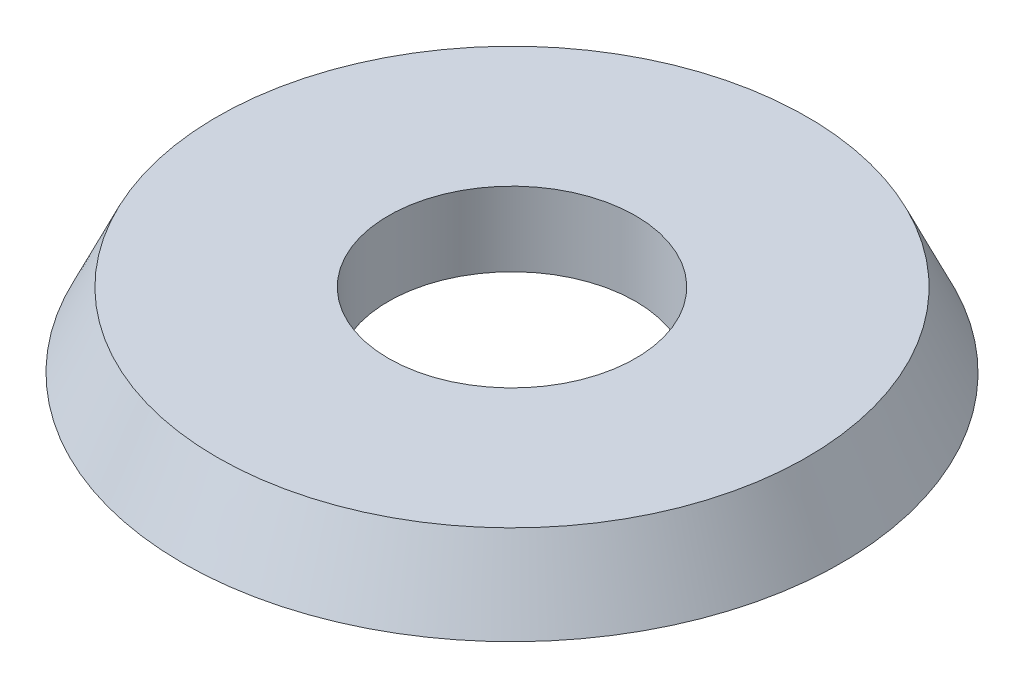
ISO-10303-21;
HEADER;
FILE_DESCRIPTION(('STEP AP214'),'2;1');
FILE_NAME('part.step','',(''),(''),'','','');
FILE_SCHEMA(('AUTOMOTIVE_DESIGN { 1 0 10303 214 1 1 1 1 }'));
ENDSEC;
DATA;
#1=APPLICATION_CONTEXT('core data for automotive mechanical design processes');
#2=APPLICATION_PROTOCOL_DEFINITION('international standard','automotive_design',2000,#1);
#3=PRODUCT_CONTEXT('',#1,'mechanical');
#4=PRODUCT('Part','Part','',(#3));
#5=PRODUCT_RELATED_PRODUCT_CATEGORY('part','',(#4));
#6=PRODUCT_DEFINITION_FORMATION('','',#4);
#7=PRODUCT_DEFINITION_CONTEXT('part definition',#1,'design');
#8=PRODUCT_DEFINITION('design','',#6,#7);
#9=PRODUCT_DEFINITION_SHAPE('','',#8);
#10=(LENGTH_UNIT() NAMED_UNIT(*) SI_UNIT(.MILLI.,.METRE.));
#11=(NAMED_UNIT(*) PLANE_ANGLE_UNIT() SI_UNIT($,.RADIAN.));
#12=(NAMED_UNIT(*) SI_UNIT($,.STERADIAN.) SOLID_ANGLE_UNIT());
#13=UNCERTAINTY_MEASURE_WITH_UNIT(LENGTH_MEASURE(1.E-05),#10,'distance_accuracy_value','');
#14=(GEOMETRIC_REPRESENTATION_CONTEXT(3) GLOBAL_UNCERTAINTY_ASSIGNED_CONTEXT((#13)) GLOBAL_UNIT_ASSIGNED_CONTEXT((#10,
#11,#12)) REPRESENTATION_CONTEXT('',''));
#15=CARTESIAN_POINT('',(0.,0.,0.));
#16=DIRECTION('',(0.,0.,1.));
#17=DIRECTION('',(1.,0.,0.));
#18=AXIS2_PLACEMENT_3D('',#15,#16,#17);
#19=CARTESIAN_POINT('',(-20.,0.,0.));
#20=DIRECTION('',(0.,-1.,0.));
#21=DIRECTION('',(0.,0.,-1.));
#22=AXIS2_PLACEMENT_3D('',#19,#20,#21);
#23=PLANE('',#22);
#24=CARTESIAN_POINT('',(0.,0.,0.));
#25=DIRECTION('',(0.,1.,0.));
#26=DIRECTION('',(0.,0.,1.));
#27=AXIS2_PLACEMENT_3D('',#24,#25,#26);
#28=CIRCLE('',#27,7.5);
#29=CARTESIAN_POINT('',(0.,0.,7.5));
#30=VERTEX_POINT('',#29);
#31=EDGE_CURVE('E10',#30,#30,#28,.T.);
#32=ORIENTED_EDGE('',*,*,#31,.T.);
#33=EDGE_LOOP('',(#32));
#34=FACE_BOUND('',#33,.T.);
#35=CARTESIAN_POINT('',(0.,0.,0.));
#36=DIRECTION('',(0.,1.,0.));
#37=DIRECTION('',(0.,0.,1.));
#38=AXIS2_PLACEMENT_3D('',#35,#36,#37);
#39=CIRCLE('',#38,20.);
#40=CARTESIAN_POINT('',(0.,0.,20.));
#41=VERTEX_POINT('',#40);
#42=EDGE_CURVE('E47',#41,#41,#39,.T.);
#43=ORIENTED_EDGE('',*,*,#42,.F.);
#44=EDGE_LOOP('',(#43));
#45=FACE_BOUND('',#44,.T.);
#46=ADVANCED_FACE('F33',(#34,#45),#23,.T.);
#47=CARTESIAN_POINT('',(0.,0.,0.));
#48=DIRECTION('',(0.,1.,0.));
#49=DIRECTION('',(0.,0.,1.));
#50=AXIS2_PLACEMENT_3D('',#47,#48,#49);
#51=CYLINDRICAL_SURFACE('',#50,7.5);
#52=CARTESIAN_POINT('',(0.,4.5,0.));
#53=DIRECTION('',(0.,1.,0.));
#54=DIRECTION('',(0.,0.,1.));
#55=AXIS2_PLACEMENT_3D('',#52,#53,#54);
#56=CIRCLE('',#55,7.5);
#57=CARTESIAN_POINT('',(0.,4.5,7.5));
#58=VERTEX_POINT('',#57);
#59=EDGE_CURVE('E39',#58,#58,#56,.T.);
#60=ORIENTED_EDGE('',*,*,#59,.T.);
#61=EDGE_LOOP('',(#60));
#62=FACE_BOUND('',#61,.T.);
#63=ORIENTED_EDGE('',*,*,#31,.F.);
#64=EDGE_LOOP('',(#63));
#65=FACE_BOUND('',#64,.T.);
#66=ADVANCED_FACE('F57',(#62,#65),#51,.F.);
#67=CARTESIAN_POINT('',(-7.5,4.5,0.));
#68=DIRECTION('',(0.,1.,0.));
#69=DIRECTION('',(0.,0.,1.));
#70=AXIS2_PLACEMENT_3D('',#67,#68,#69);
#71=PLANE('',#70);
#72=CARTESIAN_POINT('',(0.,4.5,0.));
#73=DIRECTION('',(0.,1.,0.));
#74=DIRECTION('',(0.,0.,1.));
#75=AXIS2_PLACEMENT_3D('',#72,#73,#74);
#76=CIRCLE('',#75,17.9);
#77=CARTESIAN_POINT('',(0.,4.5,17.9));
#78=VERTEX_POINT('',#77);
#79=EDGE_CURVE('E43',#78,#78,#76,.T.);
#80=ORIENTED_EDGE('',*,*,#79,.T.);
#81=EDGE_LOOP('',(#80));
#82=FACE_BOUND('',#81,.T.);
#83=ORIENTED_EDGE('',*,*,#59,.F.);
#84=EDGE_LOOP('',(#83));
#85=FACE_BOUND('',#84,.T.);
#86=ADVANCED_FACE('F61',(#82,#85),#71,.T.);
#87=CARTESIAN_POINT('',(0.,4.5,0.));
#88=DIRECTION('',(0.,-1.,0.));
#89=DIRECTION('',(0.,0.,-1.));
#90=AXIS2_PLACEMENT_3D('',#87,#88,#89);
#91=CONICAL_SURFACE('',#90,17.9,0.436627159813542);
#92=ORIENTED_EDGE('',*,*,#42,.T.);
#93=EDGE_LOOP('',(#92));
#94=FACE_BOUND('',#93,.T.);
#95=ORIENTED_EDGE('',*,*,#79,.F.);
#96=EDGE_LOOP('',(#95));
#97=FACE_BOUND('',#96,.T.);
#98=ADVANCED_FACE('F53',(#94,#97),#91,.T.);
#99=CLOSED_SHELL('',(#46,#66,#86,#98));
#100=MANIFOLD_SOLID_BREP('B2',#99);
#101=ADVANCED_BREP_SHAPE_REPRESENTATION('',(#18,#100),#14);
#102=SHAPE_DEFINITION_REPRESENTATION(#9,#101);
ENDSEC;
END-ISO-10303-21;
